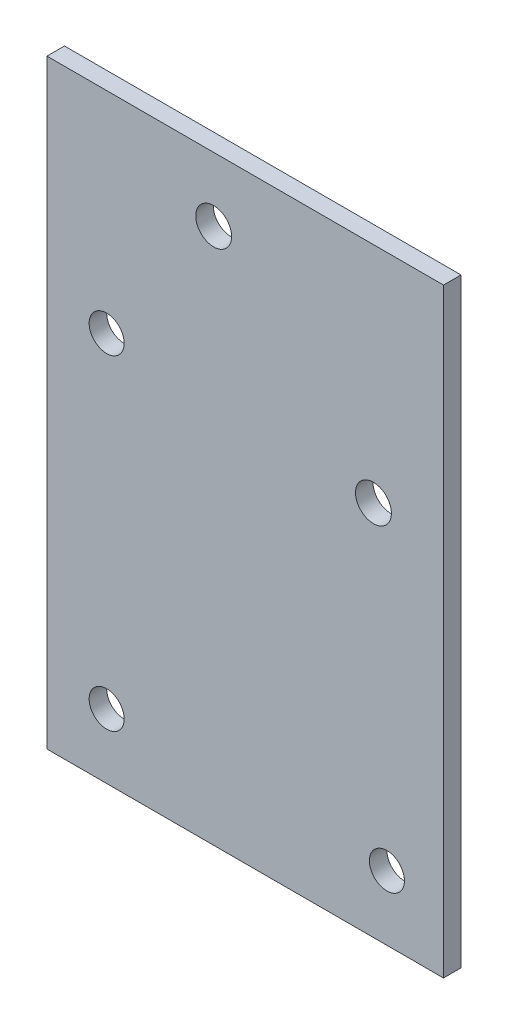
ISO-10303-21;
HEADER;
FILE_DESCRIPTION(('STEP AP214'),'2;1');
FILE_NAME('part.step','',(''),(''),'','','');
FILE_SCHEMA(('AUTOMOTIVE_DESIGN { 1 0 10303 214 1 1 1 1 }'));
ENDSEC;
DATA;
#1=APPLICATION_CONTEXT('core data for automotive mechanical design processes');
#2=APPLICATION_PROTOCOL_DEFINITION('international standard','automotive_design',2000,#1);
#3=PRODUCT_CONTEXT('',#1,'mechanical');
#4=PRODUCT('Part','Part','',(#3));
#5=PRODUCT_RELATED_PRODUCT_CATEGORY('part','',(#4));
#6=PRODUCT_DEFINITION_FORMATION('','',#4);
#7=PRODUCT_DEFINITION_CONTEXT('part definition',#1,'design');
#8=PRODUCT_DEFINITION('design','',#6,#7);
#9=PRODUCT_DEFINITION_SHAPE('','',#8);
#10=(LENGTH_UNIT() NAMED_UNIT(*) SI_UNIT(.MILLI.,.METRE.));
#11=(NAMED_UNIT(*) PLANE_ANGLE_UNIT() SI_UNIT($,.RADIAN.));
#12=(NAMED_UNIT(*) SI_UNIT($,.STERADIAN.) SOLID_ANGLE_UNIT());
#13=UNCERTAINTY_MEASURE_WITH_UNIT(LENGTH_MEASURE(1.E-05),#10,'distance_accuracy_value','');
#14=(GEOMETRIC_REPRESENTATION_CONTEXT(3) GLOBAL_UNCERTAINTY_ASSIGNED_CONTEXT((#13)) GLOBAL_UNIT_ASSIGNED_CONTEXT((#10,
#11,#12)) REPRESENTATION_CONTEXT('',''));
#15=CARTESIAN_POINT('',(0.,0.,0.));
#16=DIRECTION('',(0.,0.,1.));
#17=DIRECTION('',(1.,0.,0.));
#18=AXIS2_PLACEMENT_3D('',#15,#16,#17);
#19=CARTESIAN_POINT('',(0.,0.,3.175));
#20=DIRECTION('',(0.,0.,1.));
#21=DIRECTION('',(1.,0.,0.));
#22=AXIS2_PLACEMENT_3D('',#19,#20,#21);
#23=PLANE('',#22);
#24=CARTESIAN_POINT('',(-27.8446788568397,233.404604576393,3.175));
#25=DIRECTION('',(0.,0.,1.));
#26=DIRECTION('',(1.,0.,0.));
#27=AXIS2_PLACEMENT_3D('',#24,#25,#26);
#28=CIRCLE('',#27,3.2512);
#29=CARTESIAN_POINT('',(-24.5934788568397,233.404604576393,3.175));
#30=VERTEX_POINT('',#29);
#31=EDGE_CURVE('E133',#30,#30,#28,.T.);
#32=ORIENTED_EDGE('',*,*,#31,.F.);
#33=EDGE_LOOP('',(#32));
#34=FACE_BOUND('',#33,.T.);
#35=CARTESIAN_POINT('',(-25.4000000000006,176.892857142857,3.175));
#36=DIRECTION('',(0.,0.,1.));
#37=DIRECTION('',(1.,0.,0.));
#38=AXIS2_PLACEMENT_3D('',#35,#36,#37);
#39=CIRCLE('',#38,3.17500000000001);
#40=CARTESIAN_POINT('',(-22.2250000000006,176.892857142857,3.175));
#41=VERTEX_POINT('',#40);
#42=EDGE_CURVE('E121',#41,#41,#39,.T.);
#43=ORIENTED_EDGE('',*,*,#42,.F.);
#44=EDGE_LOOP('',(#43));
#45=FACE_BOUND('',#44,.T.);
#46=DIRECTION('',(0.,1.,0.));
#47=VECTOR('',#46,1.);
#48=CARTESIAN_POINT('',(-15.1446788568397,165.187480114208,3.175));
#49=LINE('',#48,#47);
#50=CARTESIAN_POINT('',(-15.1446788568397,165.187480114208,3.175));
#51=VERTEX_POINT('',#50);
#52=CARTESIAN_POINT('',(-15.1446788568397,273.957142857143,3.175));
#53=VERTEX_POINT('',#52);
#54=EDGE_CURVE('E91',#51,#53,#49,.T.);
#55=ORIENTED_EDGE('',*,*,#54,.T.);
#56=DIRECTION('',(-1.,0.,0.));
#57=VECTOR('',#56,1.);
#58=CARTESIAN_POINT('',(-15.1446788568397,273.957142857143,3.175));
#59=LINE('',#58,#57);
#60=CARTESIAN_POINT('',(-87.0131832948946,273.957142857143,3.175));
#61=VERTEX_POINT('',#60);
#62=EDGE_CURVE('E86',#53,#61,#59,.T.);
#63=ORIENTED_EDGE('',*,*,#62,.T.);
#64=DIRECTION('',(0.,-1.,0.));
#65=VECTOR('',#64,1.);
#66=CARTESIAN_POINT('',(-87.0131832948946,165.187480114208,3.175));
#67=LINE('',#66,#65);
#68=CARTESIAN_POINT('',(-87.0131832948946,165.187480114208,3.175));
#69=VERTEX_POINT('',#68);
#70=EDGE_CURVE('E89',#61,#69,#67,.T.);
#71=ORIENTED_EDGE('',*,*,#70,.T.);
#72=DIRECTION('',(1.,0.,0.));
#73=VECTOR('',#72,1.);
#74=CARTESIAN_POINT('',(-15.1446788568397,165.187480114208,3.175));
#75=LINE('',#74,#73);
#76=EDGE_CURVE('E56',#69,#51,#75,.T.);
#77=ORIENTED_EDGE('',*,*,#76,.T.);
#78=EDGE_LOOP('',(#55,#63,#71,#77));
#79=FACE_BOUND('',#78,.T.);
#80=CARTESIAN_POINT('',(-76.2000000000008,235.857142857143,3.175));
#81=DIRECTION('',(0.,0.,1.));
#82=DIRECTION('',(1.,0.,0.));
#83=AXIS2_PLACEMENT_3D('',#80,#81,#82);
#84=CIRCLE('',#83,3.17499999999998);
#85=CARTESIAN_POINT('',(-73.0250000000008,235.857142857143,3.175));
#86=VERTEX_POINT('',#85);
#87=EDGE_CURVE('E106',#86,#86,#84,.T.);
#88=ORIENTED_EDGE('',*,*,#87,.F.);
#89=EDGE_LOOP('',(#88));
#90=FACE_BOUND('',#89,.T.);
#91=CARTESIAN_POINT('',(-76.2000000000006,176.892857142857,3.175));
#92=DIRECTION('',(0.,0.,1.));
#93=DIRECTION('',(1.,0.,0.));
#94=AXIS2_PLACEMENT_3D('',#91,#92,#93);
#95=CIRCLE('',#94,3.17499999999998);
#96=CARTESIAN_POINT('',(-73.0250000000006,176.892857142857,3.175));
#97=VERTEX_POINT('',#96);
#98=EDGE_CURVE('E127',#97,#97,#95,.T.);
#99=ORIENTED_EDGE('',*,*,#98,.F.);
#100=EDGE_LOOP('',(#99));
#101=FACE_BOUND('',#100,.T.);
#102=CARTESIAN_POINT('',(-56.8006788568397,262.360604576393,3.175));
#103=DIRECTION('',(0.,0.,1.));
#104=DIRECTION('',(1.,0.,0.));
#105=AXIS2_PLACEMENT_3D('',#102,#103,#104);
#106=CIRCLE('',#105,3.2512);
#107=CARTESIAN_POINT('',(-53.5494788568397,262.360604576393,3.175));
#108=VERTEX_POINT('',#107);
#109=EDGE_CURVE('E139',#108,#108,#106,.T.);
#110=ORIENTED_EDGE('',*,*,#109,.F.);
#111=EDGE_LOOP('',(#110));
#112=FACE_BOUND('',#111,.T.);
#113=ADVANCED_FACE('F39',(#34,#45,#79,#90,#101,#112),#23,.T.);
#114=CARTESIAN_POINT('',(0.,0.,0.));
#115=DIRECTION('',(0.,0.,1.));
#116=DIRECTION('',(1.,0.,0.));
#117=AXIS2_PLACEMENT_3D('',#114,#115,#116);
#118=PLANE('',#117);
#119=DIRECTION('',(0.,1.,0.));
#120=VECTOR('',#119,1.);
#121=CARTESIAN_POINT('',(-15.1446788568397,165.187480114208,0.));
#122=LINE('',#121,#120);
#123=CARTESIAN_POINT('',(-15.1446788568397,165.187480114208,0.));
#124=VERTEX_POINT('',#123);
#125=CARTESIAN_POINT('',(-15.1446788568397,273.957142857143,0.));
#126=VERTEX_POINT('',#125);
#127=EDGE_CURVE('E103',#124,#126,#122,.T.);
#128=ORIENTED_EDGE('',*,*,#127,.F.);
#129=DIRECTION('',(1.,0.,0.));
#130=VECTOR('',#129,1.);
#131=CARTESIAN_POINT('',(-15.1446788568397,165.187480114208,0.));
#132=LINE('',#131,#130);
#133=CARTESIAN_POINT('',(-87.0131832948946,165.187480114208,0.));
#134=VERTEX_POINT('',#133);
#135=EDGE_CURVE('E79',#134,#124,#132,.T.);
#136=ORIENTED_EDGE('',*,*,#135,.F.);
#137=DIRECTION('',(0.,-1.,0.));
#138=VECTOR('',#137,1.);
#139=CARTESIAN_POINT('',(-87.0131832948946,165.187480114208,0.));
#140=LINE('',#139,#138);
#141=CARTESIAN_POINT('',(-87.0131832948946,273.957142857143,0.));
#142=VERTEX_POINT('',#141);
#143=EDGE_CURVE('E73',#142,#134,#140,.T.);
#144=ORIENTED_EDGE('',*,*,#143,.F.);
#145=DIRECTION('',(-1.,0.,0.));
#146=VECTOR('',#145,1.);
#147=CARTESIAN_POINT('',(-15.1446788568397,273.957142857143,0.));
#148=LINE('',#147,#146);
#149=EDGE_CURVE('E95',#126,#142,#148,.T.);
#150=ORIENTED_EDGE('',*,*,#149,.F.);
#151=EDGE_LOOP('',(#128,#136,#144,#150));
#152=FACE_BOUND('',#151,.T.);
#153=CARTESIAN_POINT('',(-76.2000000000008,235.857142857143,0.));
#154=DIRECTION('',(0.,0.,1.));
#155=DIRECTION('',(1.,0.,0.));
#156=AXIS2_PLACEMENT_3D('',#153,#154,#155);
#157=CIRCLE('',#156,3.17499999999998);
#158=CARTESIAN_POINT('',(-73.0250000000008,235.857142857143,0.));
#159=VERTEX_POINT('',#158);
#160=EDGE_CURVE('E118',#159,#159,#157,.T.);
#161=ORIENTED_EDGE('',*,*,#160,.T.);
#162=EDGE_LOOP('',(#161));
#163=FACE_BOUND('',#162,.T.);
#164=CARTESIAN_POINT('',(-25.4000000000006,176.892857142857,0.));
#165=DIRECTION('',(0.,0.,1.));
#166=DIRECTION('',(1.,0.,0.));
#167=AXIS2_PLACEMENT_3D('',#164,#165,#166);
#168=CIRCLE('',#167,3.17500000000001);
#169=CARTESIAN_POINT('',(-22.2250000000006,176.892857142857,0.));
#170=VERTEX_POINT('',#169);
#171=EDGE_CURVE('E124',#170,#170,#168,.T.);
#172=ORIENTED_EDGE('',*,*,#171,.T.);
#173=EDGE_LOOP('',(#172));
#174=FACE_BOUND('',#173,.T.);
#175=CARTESIAN_POINT('',(-76.2000000000006,176.892857142857,0.));
#176=DIRECTION('',(0.,0.,1.));
#177=DIRECTION('',(1.,0.,0.));
#178=AXIS2_PLACEMENT_3D('',#175,#176,#177);
#179=CIRCLE('',#178,3.17499999999998);
#180=CARTESIAN_POINT('',(-73.0250000000006,176.892857142857,0.));
#181=VERTEX_POINT('',#180);
#182=EDGE_CURVE('E130',#181,#181,#179,.T.);
#183=ORIENTED_EDGE('',*,*,#182,.T.);
#184=EDGE_LOOP('',(#183));
#185=FACE_BOUND('',#184,.T.);
#186=CARTESIAN_POINT('',(-27.8446788568397,233.404604576393,0.));
#187=DIRECTION('',(0.,0.,1.));
#188=DIRECTION('',(1.,0.,0.));
#189=AXIS2_PLACEMENT_3D('',#186,#187,#188);
#190=CIRCLE('',#189,3.2512);
#191=CARTESIAN_POINT('',(-24.5934788568397,233.404604576393,0.));
#192=VERTEX_POINT('',#191);
#193=EDGE_CURVE('E136',#192,#192,#190,.T.);
#194=ORIENTED_EDGE('',*,*,#193,.T.);
#195=EDGE_LOOP('',(#194));
#196=FACE_BOUND('',#195,.T.);
#197=CARTESIAN_POINT('',(-56.8006788568397,262.360604576393,0.));
#198=DIRECTION('',(0.,0.,1.));
#199=DIRECTION('',(1.,0.,0.));
#200=AXIS2_PLACEMENT_3D('',#197,#198,#199);
#201=CIRCLE('',#200,3.2512);
#202=CARTESIAN_POINT('',(-53.5494788568397,262.360604576393,0.));
#203=VERTEX_POINT('',#202);
#204=EDGE_CURVE('E142',#203,#203,#201,.T.);
#205=ORIENTED_EDGE('',*,*,#204,.T.);
#206=EDGE_LOOP('',(#205));
#207=FACE_BOUND('',#206,.T.);
#208=ADVANCED_FACE('F114',(#152,#163,#174,#185,#196,#207),#118,.F.);
#209=CARTESIAN_POINT('',(-15.1446788568397,165.187480114208,3.175));
#210=DIRECTION('',(-1.,0.,0.));
#211=DIRECTION('',(0.,-1.,0.));
#212=AXIS2_PLACEMENT_3D('',#209,#210,#211);
#213=PLANE('',#212);
#214=ORIENTED_EDGE('',*,*,#127,.T.);
#215=DIRECTION('',(0.,0.,-1.));
#216=VECTOR('',#215,1.);
#217=CARTESIAN_POINT('',(-15.1446788568397,273.957142857143,3.175));
#218=LINE('',#217,#216);
#219=EDGE_CURVE('E11',#53,#126,#218,.T.);
#220=ORIENTED_EDGE('',*,*,#219,.F.);
#221=ORIENTED_EDGE('',*,*,#54,.F.);
#222=DIRECTION('',(0.,0.,-1.));
#223=VECTOR('',#222,1.);
#224=CARTESIAN_POINT('',(-15.1446788568397,165.187480114208,3.175));
#225=LINE('',#224,#223);
#226=EDGE_CURVE('E99',#51,#124,#225,.T.);
#227=ORIENTED_EDGE('',*,*,#226,.T.);
#228=EDGE_LOOP('',(#214,#220,#221,#227));
#229=FACE_BOUND('',#228,.T.);
#230=ADVANCED_FACE('F41',(#229),#213,.F.);
#231=CARTESIAN_POINT('',(-15.1446788568397,273.957142857143,3.175));
#232=DIRECTION('',(0.,-1.,0.));
#233=DIRECTION('',(0.,0.,-1.));
#234=AXIS2_PLACEMENT_3D('',#231,#232,#233);
#235=PLANE('',#234);
#236=ORIENTED_EDGE('',*,*,#149,.T.);
#237=DIRECTION('',(0.,0.,-1.));
#238=VECTOR('',#237,1.);
#239=CARTESIAN_POINT('',(-87.0131832948946,273.957142857143,3.175));
#240=LINE('',#239,#238);
#241=EDGE_CURVE('E48',#61,#142,#240,.T.);
#242=ORIENTED_EDGE('',*,*,#241,.F.);
#243=ORIENTED_EDGE('',*,*,#62,.F.);
#244=ORIENTED_EDGE('',*,*,#219,.T.);
#245=EDGE_LOOP('',(#236,#242,#243,#244));
#246=FACE_BOUND('',#245,.T.);
#247=ADVANCED_FACE('F94',(#246),#235,.F.);
#248=CARTESIAN_POINT('',(-87.0131832948946,165.187480114208,3.175));
#249=DIRECTION('',(1.,0.,0.));
#250=DIRECTION('',(0.,0.,-1.));
#251=AXIS2_PLACEMENT_3D('',#248,#249,#250);
#252=PLANE('',#251);
#253=ORIENTED_EDGE('',*,*,#143,.T.);
#254=DIRECTION('',(0.,0.,-1.));
#255=VECTOR('',#254,1.);
#256=CARTESIAN_POINT('',(-87.0131832948946,165.187480114208,3.175));
#257=LINE('',#256,#255);
#258=EDGE_CURVE('E96',#69,#134,#257,.T.);
#259=ORIENTED_EDGE('',*,*,#258,.F.);
#260=ORIENTED_EDGE('',*,*,#70,.F.);
#261=ORIENTED_EDGE('',*,*,#241,.T.);
#262=EDGE_LOOP('',(#253,#259,#260,#261));
#263=FACE_BOUND('',#262,.T.);
#264=ADVANCED_FACE('F97',(#263),#252,.F.);
#265=CARTESIAN_POINT('',(-15.1446788568397,165.187480114208,3.175));
#266=DIRECTION('',(0.,1.,0.));
#267=DIRECTION('',(-1.,0.,0.));
#268=AXIS2_PLACEMENT_3D('',#265,#266,#267);
#269=PLANE('',#268);
#270=ORIENTED_EDGE('',*,*,#135,.T.);
#271=ORIENTED_EDGE('',*,*,#226,.F.);
#272=ORIENTED_EDGE('',*,*,#76,.F.);
#273=ORIENTED_EDGE('',*,*,#258,.T.);
#274=EDGE_LOOP('',(#270,#271,#272,#273));
#275=FACE_BOUND('',#274,.T.);
#276=ADVANCED_FACE('F111',(#275),#269,.F.);
#277=CARTESIAN_POINT('',(-76.2000000000008,235.857142857143,3.175));
#278=DIRECTION('',(0.,0.,-1.));
#279=DIRECTION('',(-1.,0.,0.));
#280=AXIS2_PLACEMENT_3D('',#277,#278,#279);
#281=CYLINDRICAL_SURFACE('',#280,3.17499999999998);
#282=ORIENTED_EDGE('',*,*,#87,.T.);
#283=EDGE_LOOP('',(#282));
#284=FACE_BOUND('',#283,.T.);
#285=ORIENTED_EDGE('',*,*,#160,.F.);
#286=EDGE_LOOP('',(#285));
#287=FACE_BOUND('',#286,.T.);
#288=ADVANCED_FACE('F161',(#284,#287),#281,.F.);
#289=CARTESIAN_POINT('',(-25.4000000000006,176.892857142857,3.175));
#290=DIRECTION('',(0.,0.,-1.));
#291=DIRECTION('',(-1.,0.,0.));
#292=AXIS2_PLACEMENT_3D('',#289,#290,#291);
#293=CYLINDRICAL_SURFACE('',#292,3.17500000000001);
#294=ORIENTED_EDGE('',*,*,#42,.T.);
#295=EDGE_LOOP('',(#294));
#296=FACE_BOUND('',#295,.T.);
#297=ORIENTED_EDGE('',*,*,#171,.F.);
#298=EDGE_LOOP('',(#297));
#299=FACE_BOUND('',#298,.T.);
#300=ADVANCED_FACE('F206',(#296,#299),#293,.F.);
#301=CARTESIAN_POINT('',(-76.2000000000006,176.892857142857,3.175));
#302=DIRECTION('',(0.,0.,-1.));
#303=DIRECTION('',(-1.,0.,0.));
#304=AXIS2_PLACEMENT_3D('',#301,#302,#303);
#305=CYLINDRICAL_SURFACE('',#304,3.17499999999998);
#306=ORIENTED_EDGE('',*,*,#98,.T.);
#307=EDGE_LOOP('',(#306));
#308=FACE_BOUND('',#307,.T.);
#309=ORIENTED_EDGE('',*,*,#182,.F.);
#310=EDGE_LOOP('',(#309));
#311=FACE_BOUND('',#310,.T.);
#312=ADVANCED_FACE('F214',(#308,#311),#305,.F.);
#313=CARTESIAN_POINT('',(-27.8446788568397,233.404604576393,3.175));
#314=DIRECTION('',(0.,0.,-1.));
#315=DIRECTION('',(-1.,0.,0.));
#316=AXIS2_PLACEMENT_3D('',#313,#314,#315);
#317=CYLINDRICAL_SURFACE('',#316,3.2512);
#318=ORIENTED_EDGE('',*,*,#31,.T.);
#319=EDGE_LOOP('',(#318));
#320=FACE_BOUND('',#319,.T.);
#321=ORIENTED_EDGE('',*,*,#193,.F.);
#322=EDGE_LOOP('',(#321));
#323=FACE_BOUND('',#322,.T.);
#324=ADVANCED_FACE('F222',(#320,#323),#317,.F.);
#325=CARTESIAN_POINT('',(-56.8006788568397,262.360604576393,3.175));
#326=DIRECTION('',(0.,0.,-1.));
#327=DIRECTION('',(-1.,0.,0.));
#328=AXIS2_PLACEMENT_3D('',#325,#326,#327);
#329=CYLINDRICAL_SURFACE('',#328,3.2512);
#330=ORIENTED_EDGE('',*,*,#109,.T.);
#331=EDGE_LOOP('',(#330));
#332=FACE_BOUND('',#331,.T.);
#333=ORIENTED_EDGE('',*,*,#204,.F.);
#334=EDGE_LOOP('',(#333));
#335=FACE_BOUND('',#334,.T.);
#336=ADVANCED_FACE('F148',(#332,#335),#329,.F.);
#337=CLOSED_SHELL('',(#113,#208,#230,#247,#264,#276,#288,#300,#312,#324,#336));
#338=MANIFOLD_SOLID_BREP('B2',#337);
#339=ADVANCED_BREP_SHAPE_REPRESENTATION('',(#18,#338),#14);
#340=SHAPE_DEFINITION_REPRESENTATION(#9,#339);
ENDSEC;
END-ISO-10303-21;
